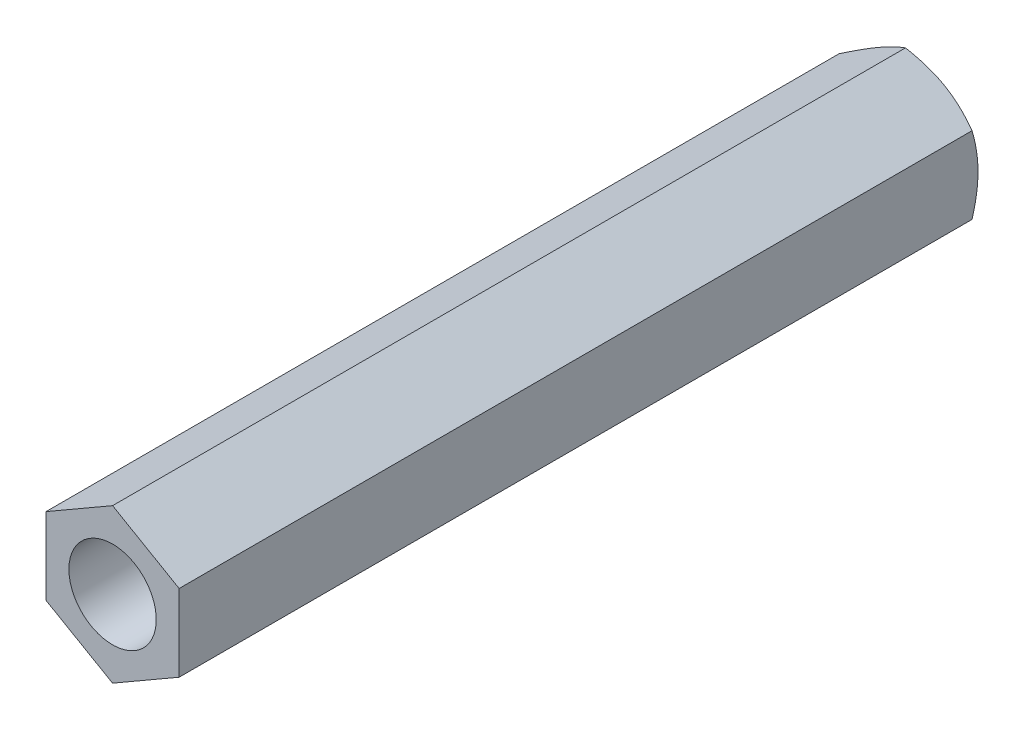
ISO-10303-21;
HEADER;
FILE_DESCRIPTION(('STEP AP214'),'2;1');
FILE_NAME('part.step','',(''),(''),'','','');
FILE_SCHEMA(('AUTOMOTIVE_DESIGN { 1 0 10303 214 1 1 1 1 }'));
ENDSEC;
DATA;
#1=APPLICATION_CONTEXT('core data for automotive mechanical design processes');
#2=APPLICATION_PROTOCOL_DEFINITION('international standard','automotive_design',2000,#1);
#3=PRODUCT_CONTEXT('',#1,'mechanical');
#4=PRODUCT('Part','Part','',(#3));
#5=PRODUCT_RELATED_PRODUCT_CATEGORY('part','',(#4));
#6=PRODUCT_DEFINITION_FORMATION('','',#4);
#7=PRODUCT_DEFINITION_CONTEXT('part definition',#1,'design');
#8=PRODUCT_DEFINITION('design','',#6,#7);
#9=PRODUCT_DEFINITION_SHAPE('','',#8);
#10=(LENGTH_UNIT() NAMED_UNIT(*) SI_UNIT(.MILLI.,.METRE.));
#11=(NAMED_UNIT(*) PLANE_ANGLE_UNIT() SI_UNIT($,.RADIAN.));
#12=(NAMED_UNIT(*) SI_UNIT($,.STERADIAN.) SOLID_ANGLE_UNIT());
#13=UNCERTAINTY_MEASURE_WITH_UNIT(LENGTH_MEASURE(1.E-05),#10,'distance_accuracy_value','');
#14=(GEOMETRIC_REPRESENTATION_CONTEXT(3) GLOBAL_UNCERTAINTY_ASSIGNED_CONTEXT((#13)) GLOBAL_UNIT_ASSIGNED_CONTEXT((#10,
#11,#12)) REPRESENTATION_CONTEXT('',''));
#15=CARTESIAN_POINT('',(0.,0.,0.));
#16=DIRECTION('',(0.,0.,1.));
#17=DIRECTION('',(1.,0.,0.));
#18=AXIS2_PLACEMENT_3D('',#15,#16,#17);
#19=CARTESIAN_POINT('',(3.175,1.83308710467706,19.05));
#20=DIRECTION('',(-0.499999999999999,-0.866025403784439,0.));
#21=DIRECTION('',(0.866025403784439,-0.499999999999999,0.));
#22=AXIS2_PLACEMENT_3D('',#19,#20,#21);
#23=PLANE('',#22);
#24=CARTESIAN_POINT('',(-0.000200000000001707,3.66628967940796,-18.7663537681942));
#25=CARTESIAN_POINT('',(0.139325396739817,3.58573465404144,-18.8128800659768));
#26=CARTESIAN_POINT('',(0.280055167271127,3.50448428314219,-18.8551941350917));
#27=CARTESIAN_POINT('',(0.56395162529974,3.34057658667739,-18.9290539912917));
#28=CARTESIAN_POINT('',(0.707123357483716,3.25791634856063,-18.960573649091));
#29=CARTESIAN_POINT('',(0.991692464990165,3.09362029773873,-19.0096388950167));
#30=CARTESIAN_POINT('',(1.1330460542292,3.01200976494065,-19.0275110330969));
#31=CARTESIAN_POINT('',(1.41641839775671,2.84840466612415,-19.0488471859677));
#32=CARTESIAN_POINT('',(1.55843612196593,2.76641069482226,-19.0523288683681));
#33=CARTESIAN_POINT('',(1.82380736546737,2.61319853595151,-19.0450882992778));
#34=CARTESIAN_POINT('',(1.94720059658621,2.54195742074888,-19.0361438538564));
#35=CARTESIAN_POINT('',(2.19318314733012,2.39993932886093,-19.0077944236316));
#36=CARTESIAN_POINT('',(2.31577161605926,2.32916284344061,-18.9883797532901));
#37=CARTESIAN_POINT('',(2.5622613944255,2.18685190354838,-18.9398442691888));
#38=CARTESIAN_POINT('',(2.68613150457856,2.11533546210696,-18.9105177015272));
#39=CARTESIAN_POINT('',(2.93202416035301,1.97336927110383,-18.8439578063378));
#40=CARTESIAN_POINT('',(3.05404985657409,1.90291770254254,-18.8067401195501));
#41=CARTESIAN_POINT('',(3.1752,1.83297163462323,-18.7663537681942));
#42=B_SPLINE_CURVE_WITH_KNOTS('',3,(#24,#25,#26,#27,#28,#29,#30,#31,#32,#33,#34,#35,#36,#37,#38,
#39,#40,#41),.UNSPECIFIED.,.F.,.F.,(4,2,2,2,2,2,2,2,4),(0.,0.503278731073367,1.00776724301492,
1.49976968502821,1.99116790059651,2.41904879402149,2.84732618162394,3.28510386250597,
3.72202181665388),.UNSPECIFIED.);
#43=CARTESIAN_POINT('',(0.,3.66617420935412,-18.7664204380104));
#44=VERTEX_POINT('',#43);
#45=CARTESIAN_POINT('',(1.5875,2.74963065701559,-19.05));
#46=VERTEX_POINT('',#45);
#47=EDGE_CURVE('E63',#44,#46,#42,.T.);
#48=ORIENTED_EDGE('',*,*,#47,.F.);
#49=DIRECTION('',(0.,0.,-1.));
#50=VECTOR('',#49,1.);
#51=CARTESIAN_POINT('',(0.,3.66617420935412,19.05));
#52=LINE('',#51,#50);
#53=CARTESIAN_POINT('',(0.,3.66617420935412,19.05));
#54=VERTEX_POINT('',#53);
#55=EDGE_CURVE('E184',#54,#44,#52,.T.);
#56=ORIENTED_EDGE('',*,*,#55,.F.);
#57=DIRECTION('',(-0.866025403784439,0.499999999999999,0.));
#58=VECTOR('',#57,1.);
#59=CARTESIAN_POINT('',(3.175,1.83308710467706,19.05));
#60=LINE('',#59,#58);
#61=CARTESIAN_POINT('',(3.175,1.83308710467706,19.05));
#62=VERTEX_POINT('',#61);
#63=EDGE_CURVE('E300',#62,#54,#60,.T.);
#64=ORIENTED_EDGE('',*,*,#63,.F.);
#65=DIRECTION('',(0.,0.,-1.));
#66=VECTOR('',#65,1.);
#67=CARTESIAN_POINT('',(3.175,1.83308710467706,19.05));
#68=LINE('',#67,#66);
#69=CARTESIAN_POINT('',(3.175,1.83308710467706,-18.7664204380104));
#70=VERTEX_POINT('',#69);
#71=EDGE_CURVE('E165',#62,#70,#68,.T.);
#72=ORIENTED_EDGE('',*,*,#71,.T.);
#73=EDGE_CURVE('E158',#46,#70,#42,.T.);
#74=ORIENTED_EDGE('',*,*,#73,.F.);
#75=EDGE_LOOP('',(#48,#56,#64,#72,#74));
#76=FACE_BOUND('',#75,.T.);
#77=ADVANCED_FACE('F43',(#76),#23,.F.);
#78=CARTESIAN_POINT('',(0.,3.66617420935412,19.05));
#79=DIRECTION('',(0.5,-0.866025403784438,0.));
#80=DIRECTION('',(0.866025403784438,0.5,0.));
#81=AXIS2_PLACEMENT_3D('',#78,#79,#80);
#82=PLANE('',#81);
#83=CARTESIAN_POINT('',(-3.1752,1.83297163462322,-18.7663537681942));
#84=CARTESIAN_POINT('',(-3.03567460326018,1.91352665998975,-18.8128800659768));
#85=CARTESIAN_POINT('',(-2.89494483272887,1.99477703088899,-18.8551941350917));
#86=CARTESIAN_POINT('',(-2.61104837470026,2.15868472735379,-18.9290539912917));
#87=CARTESIAN_POINT('',(-2.46787664251628,2.24134496547056,-18.960573649091));
#88=CARTESIAN_POINT('',(-2.18330753500983,2.40564101629246,-19.0096388950167));
#89=CARTESIAN_POINT('',(-2.0419539457708,2.48725154909053,-19.0275110330969));
#90=CARTESIAN_POINT('',(-1.75858160224329,2.65085664790703,-19.0488471859677));
#91=CARTESIAN_POINT('',(-1.61656387803407,2.73285061920893,-19.0523288683681));
#92=CARTESIAN_POINT('',(-1.35119263453263,2.88606277807967,-19.0450882992778));
#93=CARTESIAN_POINT('',(-1.22779940341379,2.95730389328231,-19.0361438538564));
#94=CARTESIAN_POINT('',(-0.981816852669883,3.09932198517026,-19.0077944236316));
#95=CARTESIAN_POINT('',(-0.859228383940737,3.17009847059057,-18.9883797532901));
#96=CARTESIAN_POINT('',(-0.612738605574497,3.31240941048281,-18.9398442691888));
#97=CARTESIAN_POINT('',(-0.488868495421442,3.38392585192423,-18.9105177015272));
#98=CARTESIAN_POINT('',(-0.242975839646995,3.52589204292736,-18.8439578063378));
#99=CARTESIAN_POINT('',(-0.120950143425914,3.59634361148865,-18.8067401195501));
#100=CARTESIAN_POINT('',(0.000199999999998535,3.66628967940796,-18.7663537681942));
#101=B_SPLINE_CURVE_WITH_KNOTS('',3,(#83,#84,#85,#86,#87,#88,#89,#90,#91,#92,#93,#94,#95,#96,
#97,#98,#99,#100),.UNSPECIFIED.,.F.,.F.,(4,2,2,2,2,2,2,2,4),(0.,0.503278731073367,
1.00776724301492,1.49976968502821,1.99116790059651,2.41904879402149,2.84732618162394,
3.28510386250597,3.72202181665389),.UNSPECIFIED.);
#102=CARTESIAN_POINT('',(-3.175,1.83308710467706,-18.7664204380104));
#103=VERTEX_POINT('',#102);
#104=CARTESIAN_POINT('',(-1.5875,2.74963065701559,-19.05));
#105=VERTEX_POINT('',#104);
#106=EDGE_CURVE('E73',#103,#105,#101,.T.);
#107=ORIENTED_EDGE('',*,*,#106,.F.);
#108=DIRECTION('',(0.,0.,-1.));
#109=VECTOR('',#108,1.);
#110=CARTESIAN_POINT('',(-3.175,1.83308710467706,19.05));
#111=LINE('',#110,#109);
#112=CARTESIAN_POINT('',(-3.175,1.83308710467706,19.05));
#113=VERTEX_POINT('',#112);
#114=EDGE_CURVE('E181',#113,#103,#111,.T.);
#115=ORIENTED_EDGE('',*,*,#114,.F.);
#116=DIRECTION('',(-0.866025403784438,-0.5,0.));
#117=VECTOR('',#116,1.);
#118=CARTESIAN_POINT('',(0.,3.66617420935412,19.05));
#119=LINE('',#118,#117);
#120=EDGE_CURVE('E298',#54,#113,#119,.T.);
#121=ORIENTED_EDGE('',*,*,#120,.F.);
#122=ORIENTED_EDGE('',*,*,#55,.T.);
#123=EDGE_CURVE('E213',#105,#44,#101,.T.);
#124=ORIENTED_EDGE('',*,*,#123,.F.);
#125=EDGE_LOOP('',(#107,#115,#121,#122,#124));
#126=FACE_BOUND('',#125,.T.);
#127=ADVANCED_FACE('F220',(#126),#82,.F.);
#128=CARTESIAN_POINT('',(-3.175,1.83308710467706,19.05));
#129=DIRECTION('',(1.,0.,0.));
#130=DIRECTION('',(0.,0.,-1.));
#131=AXIS2_PLACEMENT_3D('',#128,#129,#130);
#132=PLANE('',#131);
#133=CARTESIAN_POINT('',(-3.175,-18.3077198245256,-10.1553468926019));
#134=CARTESIAN_POINT('',(-3.175,-17.7414336118744,-10.4774591611531));
#135=CARTESIAN_POINT('',(-3.175,-17.1749794962075,-10.7992773985625));
#136=CARTESIAN_POINT('',(-3.175,-16.0409710717409,-11.4423663332615));
#137=CARTESIAN_POINT('',(-3.175,-15.4734162326695,-11.7636360952922));
#138=CARTESIAN_POINT('',(-3.175,-14.3258073391395,-12.4116671623965));
#139=CARTESIAN_POINT('',(-3.175,-13.7457391640371,-12.7384034734853));
#140=CARTESIAN_POINT('',(-3.175,-12.5852209444679,-13.3897619072163));
#141=CARTESIAN_POINT('',(-3.175,-12.0047719497107,-13.714385897732));
#142=CARTESIAN_POINT('',(-3.175,-11.0191420258565,-14.2626524526183));
#143=CARTESIAN_POINT('',(-3.175,-10.6143432188106,-14.4869816120892));
#144=CARTESIAN_POINT('',(-3.175,-9.80376519343896,-14.9338608056584));
#145=CARTESIAN_POINT('',(-3.175,-9.39798597859403,-15.1564108460611));
#146=CARTESIAN_POINT('',(-3.175,-8.58352092055346,-15.599811955528));
#147=CARTESIAN_POINT('',(-3.175,-8.17482988492007,-15.8206534962061));
#148=CARTESIAN_POINT('',(-3.175,-7.35556605328097,-16.258489895697));
#149=CARTESIAN_POINT('',(-3.175,-6.94499396509323,-16.4754860723258));
#150=CARTESIAN_POINT('',(-3.175,-6.33011777093839,-16.7947587542909));
#151=CARTESIAN_POINT('',(-3.175,-6.12699490835783,-16.8993081827817));
#152=CARTESIAN_POINT('',(-3.175,-5.71979092918565,-17.1065216467259));
#153=CARTESIAN_POINT('',(-3.175,-5.51570982445749,-17.209185705444));
#154=CARTESIAN_POINT('',(-3.175,-5.10603014130114,-17.4122034627545));
#155=CARTESIAN_POINT('',(-3.175,-4.90042979267829,-17.5125535984638));
#156=CARTESIAN_POINT('',(-3.175,-4.48765919259732,-17.7099540852167));
#157=CARTESIAN_POINT('',(-3.175,-4.28048903370909,-17.8070046290098));
#158=CARTESIAN_POINT('',(-3.175,-3.86553720313379,-17.9959421818625));
#159=CARTESIAN_POINT('',(-3.175,-3.65776983492072,-18.0878604405887));
#160=CARTESIAN_POINT('',(-3.175,-3.23950994033964,-18.2655212585588));
#161=CARTESIAN_POINT('',(-3.175,-3.02901662105306,-18.3512619710252));
#162=CARTESIAN_POINT('',(-3.175,-2.60514167741069,-18.5136797470457));
#163=CARTESIAN_POINT('',(-3.175,-2.39176872264198,-18.5903792251754));
#164=CARTESIAN_POINT('',(-3.175,-1.96089322475478,-18.731016552524));
#165=CARTESIAN_POINT('',(-3.175,-1.74339415581994,-18.7949646579037));
#166=CARTESIAN_POINT('',(-3.175,-1.48450390682431,-18.8596299108689));
#167=CARTESIAN_POINT('',(-3.175,-1.44527604575854,-18.8691226532026));
#168=CARTESIAN_POINT('',(-3.175,-1.36667302860545,-18.8874980649563));
#169=CARTESIAN_POINT('',(-3.175,-1.32729785715162,-18.8963806687472));
#170=CARTESIAN_POINT('',(-3.175,-1.20894095435893,-18.9220654189802));
#171=CARTESIAN_POINT('',(-3.175,-1.12974616630958,-18.9378998936088));
#172=CARTESIAN_POINT('',(-3.175,-0.970876430049809,-18.9667066164054));
#173=CARTESIAN_POINT('',(-3.175,-0.891201738690738,-18.97968027631));
#174=CARTESIAN_POINT('',(-3.175,-0.731408656361065,-19.0025205146401));
#175=CARTESIAN_POINT('',(-3.175,-0.65129028408484,-19.0123872229778));
#176=CARTESIAN_POINT('',(-3.175,-0.492507512919429,-19.0286127160931));
#177=CARTESIAN_POINT('',(-3.175,-0.413850711881396,-19.0350450797399));
#178=CARTESIAN_POINT('',(-3.175,-0.256342714002498,-19.0445923976316));
#179=CARTESIAN_POINT('',(-3.175,-0.177491521843976,-19.0477074310143));
#180=CARTESIAN_POINT('',(-3.175,0.0592412691015746,-19.0519350175385));
#181=CARTESIAN_POINT('',(-3.175,0.217251860980885,-19.0479248037829));
#182=CARTESIAN_POINT('',(-3.175,0.481847136035634,-19.0300339093949));
#183=CARTESIAN_POINT('',(-3.175,0.588697929183111,-19.0197248990427));
#184=CARTESIAN_POINT('',(-3.175,0.801703959788124,-18.9934186498442));
#185=CARTESIAN_POINT('',(-3.175,0.907859117778311,-18.9774207722692));
#186=CARTESIAN_POINT('',(-3.175,1.22501510253335,-18.9217345418408));
#187=CARTESIAN_POINT('',(-3.175,1.43468437185832,-18.8743552971295));
#188=CARTESIAN_POINT('',(-3.175,1.74885194367921,-18.7910296812125));
#189=CARTESIAN_POINT('',(-3.175,1.8549373084425,-18.7607187692784));
#190=CARTESIAN_POINT('',(-3.175,2.06607886933288,-18.6966710845962));
#191=CARTESIAN_POINT('',(-3.175,2.17113505546933,-18.6629342786275));
#192=CARTESIAN_POINT('',(-3.175,2.38026617545869,-18.5925949965778));
#193=CARTESIAN_POINT('',(-3.175,2.48434118051095,-18.5559927302502));
#194=CARTESIAN_POINT('',(-3.175,2.69160594572534,-18.4803848432953));
#195=CARTESIAN_POINT('',(-3.175,2.794795746035,-18.4413793323281));
#196=CARTESIAN_POINT('',(-3.175,3.13671562539364,-18.3083219008354));
#197=CARTESIAN_POINT('',(-3.175,3.37372995793029,-18.2098629997906));
#198=CARTESIAN_POINT('',(-3.175,3.8446390043056,-18.0057151300189));
#199=CARTESIAN_POINT('',(-3.175,4.07853296301211,-17.9000244478076));
#200=CARTESIAN_POINT('',(-3.175,4.54415587744704,-17.6835596122308));
#201=CARTESIAN_POINT('',(-3.175,4.77588311896816,-17.57278178634));
#202=CARTESIAN_POINT('',(-3.175,5.23756839741154,-17.3476708573541));
#203=CARTESIAN_POINT('',(-3.175,5.46752659974872,-17.2333380918324));
#204=CARTESIAN_POINT('',(-3.175,5.92668133297101,-17.0017787685871));
#205=CARTESIAN_POINT('',(-3.175,6.15587464235502,-16.8845458382158));
#206=CARTESIAN_POINT('',(-3.175,6.61324264214388,-16.6481022689275));
#207=CARTESIAN_POINT('',(-3.175,6.84141731144986,-16.528891589285));
#208=CARTESIAN_POINT('',(-3.175,7.52456448119139,-16.1691161715611));
#209=CARTESIAN_POINT('',(-3.175,7.9783549012064,-15.9263087336464));
#210=CARTESIAN_POINT('',(-3.175,8.81631592080397,-15.4735290959902));
#211=CARTESIAN_POINT('',(-3.175,9.20076397526635,-15.2640678393263));
#212=CARTESIAN_POINT('',(-3.175,9.9686618552056,-14.84321295972));
#213=CARTESIAN_POINT('',(-3.175,10.352111553102,-14.6318191040184));
#214=CARTESIAN_POINT('',(-3.175,11.1165251951853,-14.2086073671623));
#215=CARTESIAN_POINT('',(-3.175,11.4974925647695,-13.9967956643198));
#216=CARTESIAN_POINT('',(-3.175,12.2587925253838,-13.5721536847341));
#217=CARTESIAN_POINT('',(-3.175,12.6391251945714,-13.3593235481576));
#218=CARTESIAN_POINT('',(-3.175,13.01925251055,-13.1461290260034));
#219=B_SPLINE_CURVE_WITH_KNOTS('',3,(#133,#134,#135,#136,#137,#138,#139,#140,#141,#142,#143,
#144,#145,#146,#147,#148,#149,#150,#151,#152,#153,#154,#155,#156,#157,#158,#159,#160,#161,#162,
#163,#164,#165,#166,#167,#168,#169,#170,#171,#172,#173,#174,#175,#176,#177,#178,#179,#180,#181,
#182,#183,#184,#185,#186,#187,#188,#189,#190,#191,#192,#193,#194,#195,#196,#197,#198,#199,#200,
#201,#202,#203,#204,#205,#206,#207,#208,#209,#210,#211,#212,#213,#214,#215,#216,#217,#218),
.UNSPECIFIED.,.F.,.F.,(4,2,2,2,2,2,2,2,2,2,2,2,2,2,2,2,2,2,2,2,2,2,2,2,2,2,2,2,2,2,2,2,2,2,2,2,
2,2,2,2,2,2,4),(0.,1.95446426855776,3.91098956048036,5.90826616112014,7.90343413412598,
9.29183707773721,10.6802350993394,12.0738509984841,13.4669796867842,14.1523230153035,
14.8376578812268,15.5239856968566,16.2102733507044,16.89178214748,17.5734938431557,
18.2534782517595,18.9329135106573,19.0539901992569,19.1750798910614,19.4173159564094,
19.6594322157952,19.9015383501391,20.138225089356,20.3749061820872,20.8484193597508,
21.1703140964425,21.4922449859031,22.1361728610031,22.4671323021629,22.7980949529006,
23.1290333995789,23.4599567566847,24.2296988766852,24.9996240137207,25.7701139944362,
26.5405310323478,27.3128254100649,28.0851357106074,29.6291005090517,30.9425144939026,
32.2560888047696,33.5637579777836,34.8712520757708),.UNSPECIFIED.);
#220=CARTESIAN_POINT('',(-3.175,-1.83308710467706,-18.7664204380104));
#221=VERTEX_POINT('',#220);
#222=CARTESIAN_POINT('',(-3.175,0.,-19.05));
#223=VERTEX_POINT('',#222);
#224=EDGE_CURVE('E311',#221,#223,#219,.T.);
#225=ORIENTED_EDGE('',*,*,#224,.F.);
#226=DIRECTION('',(0.,0.,-1.));
#227=VECTOR('',#226,1.);
#228=CARTESIAN_POINT('',(-3.175,-1.83308710467706,19.05));
#229=LINE('',#228,#227);
#230=CARTESIAN_POINT('',(-3.175,-1.83308710467706,19.05));
#231=VERTEX_POINT('',#230);
#232=EDGE_CURVE('E171',#231,#221,#229,.T.);
#233=ORIENTED_EDGE('',*,*,#232,.F.);
#234=DIRECTION('',(0.,-1.,0.));
#235=VECTOR('',#234,1.);
#236=CARTESIAN_POINT('',(-3.175,1.83308710467706,19.05));
#237=LINE('',#236,#235);
#238=EDGE_CURVE('E293',#113,#231,#237,.T.);
#239=ORIENTED_EDGE('',*,*,#238,.F.);
#240=ORIENTED_EDGE('',*,*,#114,.T.);
#241=EDGE_CURVE('E242',#223,#103,#219,.T.);
#242=ORIENTED_EDGE('',*,*,#241,.F.);
#243=EDGE_LOOP('',(#225,#233,#239,#240,#242));
#244=FACE_BOUND('',#243,.T.);
#245=ADVANCED_FACE('F319',(#244),#132,.F.);
#246=CARTESIAN_POINT('',(-3.175,-1.83308710467706,19.05));
#247=DIRECTION('',(0.499999999999999,0.866025403784439,0.));
#248=DIRECTION('',(-0.866025403784439,0.499999999999999,0.));
#249=AXIS2_PLACEMENT_3D('',#246,#247,#248);
#250=PLANE('',#249);
#251=CARTESIAN_POINT('',(0.000200000000002277,-3.66628967940796,-18.7663537681942));
#252=CARTESIAN_POINT('',(-0.139325396739816,-3.58573465404143,-18.8128800659768));
#253=CARTESIAN_POINT('',(-0.280055167271126,-3.50448428314219,-18.8551941350917));
#254=CARTESIAN_POINT('',(-0.56395162529974,-3.34057658667739,-18.9290539912917));
#255=CARTESIAN_POINT('',(-0.707123357483716,-3.25791634856063,-18.960573649091));
#256=CARTESIAN_POINT('',(-0.991692464990164,-3.09362029773873,-19.0096388950167));
#257=CARTESIAN_POINT('',(-1.13304605422919,-3.01200976494065,-19.0275110330969));
#258=CARTESIAN_POINT('',(-1.4164183977567,-2.84840466612415,-19.0488471859677));
#259=CARTESIAN_POINT('',(-1.55843612196592,-2.76641069482226,-19.0523288683681));
#260=CARTESIAN_POINT('',(-1.82380736546737,-2.61319853595151,-19.0450882992778));
#261=CARTESIAN_POINT('',(-1.94720059658621,-2.54195742074887,-19.0361438538564));
#262=CARTESIAN_POINT('',(-2.19318314733012,-2.39993932886093,-19.0077944236316));
#263=CARTESIAN_POINT('',(-2.31577161605926,-2.32916284344061,-18.9883797532901));
#264=CARTESIAN_POINT('',(-2.5622613944255,-2.18685190354837,-18.9398442691888));
#265=CARTESIAN_POINT('',(-2.68613150457856,-2.11533546210696,-18.9105177015272));
#266=CARTESIAN_POINT('',(-2.93202416035301,-1.97336927110383,-18.8439578063378));
#267=CARTESIAN_POINT('',(-3.05404985657409,-1.90291770254253,-18.8067401195501));
#268=CARTESIAN_POINT('',(-3.1752,-1.83297163462322,-18.7663537681942));
#269=B_SPLINE_CURVE_WITH_KNOTS('',3,(#251,#252,#253,#254,#255,#256,#257,#258,#259,#260,#261,
#262,#263,#264,#265,#266,#267,#268),.UNSPECIFIED.,.F.,.F.,(4,2,2,2,2,2,2,2,4),(0.,
0.503278731073367,1.00776724301492,1.49976968502821,1.9911679005965,2.41904879402148,
2.84732618162394,3.28510386250597,3.72202181665389),.UNSPECIFIED.);
#270=CARTESIAN_POINT('',(0.,-3.66617420935412,-18.7664204380104));
#271=VERTEX_POINT('',#270);
#272=CARTESIAN_POINT('',(-1.5875,-2.74963065701559,-19.05));
#273=VERTEX_POINT('',#272);
#274=EDGE_CURVE('E223',#271,#273,#269,.T.);
#275=ORIENTED_EDGE('',*,*,#274,.F.);
#276=DIRECTION('',(0.,0.,-1.));
#277=VECTOR('',#276,1.);
#278=CARTESIAN_POINT('',(0.,-3.66617420935412,19.05));
#279=LINE('',#278,#277);
#280=CARTESIAN_POINT('',(0.,-3.66617420935412,19.05));
#281=VERTEX_POINT('',#280);
#282=EDGE_CURVE('E164',#281,#271,#279,.T.);
#283=ORIENTED_EDGE('',*,*,#282,.F.);
#284=DIRECTION('',(0.866025403784439,-0.499999999999999,0.));
#285=VECTOR('',#284,1.);
#286=CARTESIAN_POINT('',(-3.175,-1.83308710467706,19.05));
#287=LINE('',#286,#285);
#288=EDGE_CURVE('E289',#231,#281,#287,.T.);
#289=ORIENTED_EDGE('',*,*,#288,.F.);
#290=ORIENTED_EDGE('',*,*,#232,.T.);
#291=EDGE_CURVE('E227',#273,#221,#269,.T.);
#292=ORIENTED_EDGE('',*,*,#291,.F.);
#293=EDGE_LOOP('',(#275,#283,#289,#290,#292));
#294=FACE_BOUND('',#293,.T.);
#295=ADVANCED_FACE('F285',(#294),#250,.F.);
#296=CARTESIAN_POINT('',(0.,-3.66617420935412,19.05));
#297=DIRECTION('',(-0.5,0.866025403784438,0.));
#298=DIRECTION('',(-0.866025403784438,-0.5,0.));
#299=AXIS2_PLACEMENT_3D('',#296,#297,#298);
#300=PLANE('',#299);
#301=CARTESIAN_POINT('',(3.1752,-1.83297163462322,-18.7663537681942));
#302=CARTESIAN_POINT('',(3.03567460326018,-1.91352665998974,-18.8128800659768));
#303=CARTESIAN_POINT('',(2.89494483272887,-1.99477703088899,-18.8551941350917));
#304=CARTESIAN_POINT('',(2.61104837470026,-2.15868472735379,-18.9290539912917));
#305=CARTESIAN_POINT('',(2.46787664251628,-2.24134496547055,-18.960573649091));
#306=CARTESIAN_POINT('',(2.18330753500983,-2.40564101629245,-19.0096388950167));
#307=CARTESIAN_POINT('',(2.0419539457708,-2.48725154909053,-19.0275110330969));
#308=CARTESIAN_POINT('',(1.75858160224329,-2.65085664790703,-19.0488471859677));
#309=CARTESIAN_POINT('',(1.61656387803407,-2.73285061920892,-19.0523288683681));
#310=CARTESIAN_POINT('',(1.35119263453263,-2.88606277807967,-19.0450882992778));
#311=CARTESIAN_POINT('',(1.22779940341379,-2.95730389328231,-19.0361438538564));
#312=CARTESIAN_POINT('',(0.981816852669883,-3.09932198517025,-19.0077944236316));
#313=CARTESIAN_POINT('',(0.859228383940738,-3.17009847059057,-18.9883797532901));
#314=CARTESIAN_POINT('',(0.612738605574498,-3.31240941048281,-18.9398442691888));
#315=CARTESIAN_POINT('',(0.488868495421443,-3.38392585192422,-18.9105177015272));
#316=CARTESIAN_POINT('',(0.242975839646997,-3.52589204292735,-18.8439578063378));
#317=CARTESIAN_POINT('',(0.120950143425915,-3.59634361148865,-18.8067401195501));
#318=CARTESIAN_POINT('',(-0.000199999999997255,-3.66628967940796,-18.7663537681942));
#319=B_SPLINE_CURVE_WITH_KNOTS('',3,(#301,#302,#303,#304,#305,#306,#307,#308,#309,#310,#311,
#312,#313,#314,#315,#316,#317,#318),.UNSPECIFIED.,.F.,.F.,(4,2,2,2,2,2,2,2,4),(0.,
0.503278731073367,1.00776724301492,1.49976968502821,1.9911679005965,2.41904879402148,
2.84732618162393,3.28510386250597,3.72202181665388),.UNSPECIFIED.);
#320=CARTESIAN_POINT('',(3.175,-1.83308710467711,-18.7664204380104));
#321=VERTEX_POINT('',#320);
#322=CARTESIAN_POINT('',(1.5875,-2.74963065701559,-19.05));
#323=VERTEX_POINT('',#322);
#324=EDGE_CURVE('E138',#321,#323,#319,.T.);
#325=ORIENTED_EDGE('',*,*,#324,.F.);
#326=DIRECTION('',(0.,0.,-1.));
#327=VECTOR('',#326,1.);
#328=CARTESIAN_POINT('',(3.175,-1.83308710467706,19.05));
#329=LINE('',#328,#327);
#330=CARTESIAN_POINT('',(3.175,-1.83308710467706,19.05));
#331=VERTEX_POINT('',#330);
#332=EDGE_CURVE('E153',#331,#321,#329,.T.);
#333=ORIENTED_EDGE('',*,*,#332,.F.);
#334=DIRECTION('',(0.866025403784438,0.5,0.));
#335=VECTOR('',#334,1.);
#336=CARTESIAN_POINT('',(0.,-3.66617420935412,19.05));
#337=LINE('',#336,#335);
#338=EDGE_CURVE('E287',#281,#331,#337,.T.);
#339=ORIENTED_EDGE('',*,*,#338,.F.);
#340=ORIENTED_EDGE('',*,*,#282,.T.);
#341=EDGE_CURVE('E156',#323,#271,#319,.T.);
#342=ORIENTED_EDGE('',*,*,#341,.F.);
#343=EDGE_LOOP('',(#325,#333,#339,#340,#342));
#344=FACE_BOUND('',#343,.T.);
#345=ADVANCED_FACE('F151',(#344),#300,.F.);
#346=CARTESIAN_POINT('',(3.175,-1.83308710467706,19.05));
#347=DIRECTION('',(-1.,0.,0.));
#348=DIRECTION('',(0.,-1.,0.));
#349=AXIS2_PLACEMENT_3D('',#346,#347,#348);
#350=PLANE('',#349);
#351=CARTESIAN_POINT('',(3.175,-18.3077198939669,-10.1553468530995));
#352=CARTESIAN_POINT('',(3.175,-17.7414336794976,-10.4774591227208));
#353=CARTESIAN_POINT('',(3.175,-17.1749795620134,-10.7992773612016));
#354=CARTESIAN_POINT('',(3.175,-16.0409711339116,-11.4423662980493));
#355=CARTESIAN_POINT('',(3.175,-15.4734162930224,-11.7636360611574));
#356=CARTESIAN_POINT('',(3.175,-14.3258073958419,-12.4116671304335));
#357=CARTESIAN_POINT('',(3.175,-13.7457392189069,-12.738403442617));
#358=CARTESIAN_POINT('',(3.175,-12.5852209956805,-13.3897618785448));
#359=CARTESIAN_POINT('',(3.175,-12.0047719990987,-13.7143858701626));
#360=CARTESIAN_POINT('',(3.175,-11.0191420715459,-14.2626524272701));
#361=CARTESIAN_POINT('',(3.175,-10.6143432626229,-14.4869815878543));
#362=CARTESIAN_POINT('',(3.175,-9.80376523349893,-14.9338607836541));
#363=CARTESIAN_POINT('',(3.175,-9.39798601677873,-15.1564108251741));
#364=CARTESIAN_POINT('',(3.175,-8.58352095497882,-15.599811936886));
#365=CARTESIAN_POINT('',(3.175,-8.17482991746137,-15.820653478692));
#366=CARTESIAN_POINT('',(3.175,-7.35556608205735,-16.2584898804426));
#367=CARTESIAN_POINT('',(3.175,-6.94499399198875,-16.4754860582032));
#368=CARTESIAN_POINT('',(3.175,-6.33011779502902,-16.7947587418583));
#369=CARTESIAN_POINT('',(3.175,-6.12699493152466,-16.8993081709062));
#370=CARTESIAN_POINT('',(3.175,-5.71979095050412,-17.1065216359646));
#371=CARTESIAN_POINT('',(3.175,-5.51570984485139,-17.2091856952399));
#372=CARTESIAN_POINT('',(3.175,-5.10603015984098,-17.4122034536651));
#373=CARTESIAN_POINT('',(3.175,-4.90042981028861,-17.5125535899319));
#374=CARTESIAN_POINT('',(3.175,-4.48765920834508,-17.7099540777957));
#375=CARTESIAN_POINT('',(3.175,-4.28048904852381,-17.8070046221423));
#376=CARTESIAN_POINT('',(3.175,-3.86553721608683,-17.9959421760861));
#377=CARTESIAN_POINT('',(3.175,-3.65776984694522,-18.0878604353502));
#378=CARTESIAN_POINT('',(3.175,-3.23950995049373,-18.2655212543769));
#379=CARTESIAN_POINT('',(3.175,-3.02901663026529,-18.3512619673619));
#380=CARTESIAN_POINT('',(3.175,-2.60514168472334,-18.513679744377));
#381=CARTESIAN_POINT('',(3.175,-2.39176872899704,-18.5903792229826));
#382=CARTESIAN_POINT('',(3.175,-1.96089322916193,-18.7310165512036));
#383=CARTESIAN_POINT('',(3.175,-1.74339415923684,-18.7949646569799));
#384=CARTESIAN_POINT('',(3.175,-1.48450390900375,-18.859629910337));
#385=CARTESIAN_POINT('',(3.175,-1.44527604771116,-18.8691226527367));
#386=CARTESIAN_POINT('',(3.175,-1.36667303010265,-18.8874980646158));
#387=CARTESIAN_POINT('',(3.175,-1.32729785842023,-18.896380668466));
#388=CARTESIAN_POINT('',(3.175,-1.20894095493914,-18.9220654188662));
#389=CARTESIAN_POINT('',(3.175,-1.12974616642743,-18.9378998935918));
#390=CARTESIAN_POINT('',(3.175,-0.970876429238656,-18.9667066165481));
#391=CARTESIAN_POINT('',(3.175,-0.891201737412969,-18.9796802765157));
#392=CARTESIAN_POINT('',(3.175,-0.731408654145445,-19.0025205149337));
#393=CARTESIAN_POINT('',(3.175,-0.651290281397986,-19.0123872232963));
#394=CARTESIAN_POINT('',(3.175,-0.492507509308778,-19.0286127164191));
#395=CARTESIAN_POINT('',(3.175,-0.413850707818281,-19.0350450800497));
#396=CARTESIAN_POINT('',(3.175,-0.256342709034836,-19.0445923978691));
#397=CARTESIAN_POINT('',(3.175,-0.177491516424232,-19.0477074311957));
#398=CARTESIAN_POINT('',(3.175,0.0592412758752482,-19.0519350174914));
#399=CARTESIAN_POINT('',(3.175,0.217251868652552,-19.0479248035034));
#400=CARTESIAN_POINT('',(3.175,0.481847144806088,-19.0300339086383));
#401=CARTESIAN_POINT('',(3.175,0.588697938164518,-19.0197248980995));
#402=CARTESIAN_POINT('',(3.175,0.801703969181494,-18.9934186485182));
#403=CARTESIAN_POINT('',(3.175,0.907859127372689,-18.9774207707472));
#404=CARTESIAN_POINT('',(3.175,1.22501511271807,-18.9217345397273));
#405=CARTESIAN_POINT('',(3.175,1.43468438241961,-18.8743552946174));
#406=CARTESIAN_POINT('',(3.175,1.74885195480961,-18.7910296781116));
#407=CARTESIAN_POINT('',(3.175,1.85493731977094,-18.7607187659784));
#408=CARTESIAN_POINT('',(3.175,2.06607888105491,-18.6966710809042));
#409=CARTESIAN_POINT('',(3.175,2.17113506738691,-18.6629342747428));
#410=CARTESIAN_POINT('',(3.175,2.38026618776587,-18.5925949923147));
#411=CARTESIAN_POINT('',(3.175,2.4843411930122,-18.5559927258015));
#412=CARTESIAN_POINT('',(3.175,2.69160595861467,-18.4803848384821));
#413=CARTESIAN_POINT('',(3.175,2.79479575911833,-18.4413793273362));
#414=CARTESIAN_POINT('',(3.175,3.13671563968067,-18.3083218950425));
#415=CARTESIAN_POINT('',(3.175,3.37372997321841,-18.2098629933644));
#416=CARTESIAN_POINT('',(3.175,3.84463902158936,-18.0057151223256));
#417=CARTESIAN_POINT('',(3.175,4.07853298129044,-17.9000244394803));
#418=CARTESIAN_POINT('',(3.175,4.54415589771232,-17.6835596026395));
#419=CARTESIAN_POINT('',(3.175,4.77588314022582,-17.5727817761187));
#420=CARTESIAN_POINT('',(3.175,5.23756842065429,-17.347670845878));
#421=CARTESIAN_POINT('',(3.175,5.46752662398418,-17.2333380797315));
#422=CARTESIAN_POINT('',(3.175,5.92668135919113,-17.0017787552423));
#423=CARTESIAN_POINT('',(3.175,6.15587466956713,-16.8845458242519));
#424=CARTESIAN_POINT('',(3.175,6.61324267134146,-16.6481022537301));
#425=CARTESIAN_POINT('',(3.175,6.84141734164093,-16.5288915734731));
#426=CARTESIAN_POINT('',(3.175,7.5245645143656,-16.1691161539117));
#427=CARTESIAN_POINT('',(3.175,7.9783549363725,-15.9263087147798));
#428=CARTESIAN_POINT('',(3.175,8.81631595947147,-15.4735290749839));
#429=CARTESIAN_POINT('',(3.175,9.20076401544337,-15.2640678173973));
#430=CARTESIAN_POINT('',(3.175,9.96866189840537,-14.8432129359533));
#431=CARTESIAN_POINT('',(3.175,10.352111597815,-14.6318190793368));
#432=CARTESIAN_POINT('',(3.175,11.1165252429368,-14.2086073406518));
#433=CARTESIAN_POINT('',(3.175,11.4974926140463,-13.9967956368953));
#434=CARTESIAN_POINT('',(3.175,12.2587925777135,-13.5721536554858));
#435=CARTESIAN_POINT('',(3.175,12.6391252484287,-13.3593235179994));
#436=CARTESIAN_POINT('',(3.175,13.0192525659358,-13.1461289949369));
#437=B_SPLINE_CURVE_WITH_KNOTS('',3,(#351,#352,#353,#354,#355,#356,#357,#358,#359,#360,#361,
#362,#363,#364,#365,#366,#367,#368,#369,#370,#371,#372,#373,#374,#375,#376,#377,#378,#379,#380,
#381,#382,#383,#384,#385,#386,#387,#388,#389,#390,#391,#392,#393,#394,#395,#396,#397,#398,#399,
#400,#401,#402,#403,#404,#405,#406,#407,#408,#409,#410,#411,#412,#413,#414,#415,#416,#417,#418,
#419,#420,#421,#422,#423,#424,#425,#426,#427,#428,#429,#430,#431,#432,#433,#434,#435,#436),
.UNSPECIFIED.,.F.,.F.,(4,2,2,2,2,2,2,2,2,2,2,2,2,2,2,2,2,2,2,2,2,2,2,2,2,2,2,2,2,2,2,2,2,2,2,2,
2,2,2,2,2,2,4),(0.,1.95446427488583,3.91098957314653,5.9082661801881,7.90343415958539,
9.29183710974105,10.6802351378877,12.0738510436137,13.4669797384892,14.1523230702376,
14.8376579393898,15.5239857582594,16.2102734153463,16.8917822153222,17.5734939142012,
18.2534783259903,18.9329135880668,19.0539902773742,19.1750799698869,19.4173160366512,
19.6594322974479,19.9015384332029,20.1382251737674,20.374906267846,20.8484194482092,
21.1703141855846,21.4922450757289,22.1361729521966,22.4671323940921,22.7980950455655,
23.129033492978,23.459956850818,24.2296989743211,24.9996241148593,25.7701140990761,
26.5405311404892,27.3128255217016,28.0851358257394,29.6291006311756,30.9425146213276,
32.2560889374954,33.5637581158411,34.8712522191605),.UNSPECIFIED.);
#438=CARTESIAN_POINT('',(3.175,0.,-19.05));
#439=VERTEX_POINT('',#438);
#440=EDGE_CURVE('E145',#70,#439,#437,.F.);
#441=ORIENTED_EDGE('',*,*,#440,.F.);
#442=ORIENTED_EDGE('',*,*,#71,.F.);
#443=DIRECTION('',(0.,1.,0.));
#444=VECTOR('',#443,1.);
#445=CARTESIAN_POINT('',(3.175,-1.83308710467706,19.05));
#446=LINE('',#445,#444);
#447=EDGE_CURVE('E162',#331,#62,#446,.T.);
#448=ORIENTED_EDGE('',*,*,#447,.F.);
#449=ORIENTED_EDGE('',*,*,#332,.T.);
#450=EDGE_CURVE('E135',#439,#321,#437,.F.);
#451=ORIENTED_EDGE('',*,*,#450,.F.);
#452=EDGE_LOOP('',(#441,#442,#448,#449,#451));
#453=FACE_BOUND('',#452,.T.);
#454=ADVANCED_FACE('F160',(#453),#350,.F.);
#455=CARTESIAN_POINT('',(0.,3.66617420935412,-19.05));
#456=DIRECTION('',(0.,0.,1.));
#457=DIRECTION('',(1.,0.,0.));
#458=AXIS2_PLACEMENT_3D('',#455,#456,#457);
#459=PLANE('',#458);
#460=CARTESIAN_POINT('',(0.,0.,-19.05));
#461=DIRECTION('',(0.,0.,-1.));
#462=DIRECTION('',(-1.,0.,0.));
#463=AXIS2_PLACEMENT_3D('',#460,#461,#462);
#464=CIRCLE('',#463,2.1336);
#465=CARTESIAN_POINT('',(-2.1336,0.,-19.05));
#466=VERTEX_POINT('',#465);
#467=EDGE_CURVE('E309',#466,#466,#464,.T.);
#468=ORIENTED_EDGE('',*,*,#467,.F.);
#469=EDGE_LOOP('',(#468));
#470=FACE_BOUND('',#469,.T.);
#471=CARTESIAN_POINT('',(0.,0.,-19.05));
#472=DIRECTION('',(0.,0.,1.));
#473=DIRECTION('',(1.,0.,0.));
#474=AXIS2_PLACEMENT_3D('',#471,#472,#473);
#475=CIRCLE('',#474,3.175);
#476=EDGE_CURVE('E12',#439,#46,#475,.T.);
#477=ORIENTED_EDGE('',*,*,#476,.F.);
#478=EDGE_CURVE('E47',#323,#439,#475,.T.);
#479=ORIENTED_EDGE('',*,*,#478,.F.);
#480=EDGE_CURVE('E192',#273,#323,#475,.T.);
#481=ORIENTED_EDGE('',*,*,#480,.F.);
#482=EDGE_CURVE('E194',#223,#273,#475,.T.);
#483=ORIENTED_EDGE('',*,*,#482,.F.);
#484=CARTESIAN_POINT('',(0.,0.,-19.05));
#485=DIRECTION('',(0.,0.,-1.));
#486=DIRECTION('',(-1.,0.,0.));
#487=AXIS2_PLACEMENT_3D('',#484,#485,#486);
#488=CIRCLE('',#487,3.175);
#489=EDGE_CURVE('E146',#223,#105,#488,.T.);
#490=ORIENTED_EDGE('',*,*,#489,.T.);
#491=EDGE_CURVE('E53',#46,#105,#475,.T.);
#492=ORIENTED_EDGE('',*,*,#491,.F.);
#493=EDGE_LOOP('',(#477,#479,#481,#483,#490,#492));
#494=FACE_BOUND('',#493,.T.);
#495=ADVANCED_FACE('F216',(#470,#494),#459,.F.);
#496=CARTESIAN_POINT('',(0.,3.66617420935412,19.05));
#497=DIRECTION('',(0.,0.,1.));
#498=DIRECTION('',(1.,0.,0.));
#499=AXIS2_PLACEMENT_3D('',#496,#497,#498);
#500=PLANE('',#499);
#501=ORIENTED_EDGE('',*,*,#63,.T.);
#502=ORIENTED_EDGE('',*,*,#120,.T.);
#503=ORIENTED_EDGE('',*,*,#238,.T.);
#504=ORIENTED_EDGE('',*,*,#288,.T.);
#505=ORIENTED_EDGE('',*,*,#338,.T.);
#506=ORIENTED_EDGE('',*,*,#447,.T.);
#507=EDGE_LOOP('',(#501,#502,#503,#504,#505,#506));
#508=FACE_BOUND('',#507,.T.);
#509=CARTESIAN_POINT('',(0.,0.,19.05));
#510=DIRECTION('',(0.,0.,1.));
#511=DIRECTION('',(1.,0.,0.));
#512=AXIS2_PLACEMENT_3D('',#509,#510,#511);
#513=CIRCLE('',#512,2.0828);
#514=CARTESIAN_POINT('',(-2.0828,0.,19.05));
#515=VERTEX_POINT('',#514);
#516=EDGE_CURVE('E304',#515,#515,#513,.T.);
#517=ORIENTED_EDGE('',*,*,#516,.F.);
#518=EDGE_LOOP('',(#517));
#519=FACE_BOUND('',#518,.T.);
#520=ADVANCED_FACE('F321',(#508,#519),#500,.T.);
#521=CARTESIAN_POINT('',(0.,0.,19.05));
#522=DIRECTION('',(0.,0.,-1.));
#523=DIRECTION('',(-1.,0.,0.));
#524=AXIS2_PLACEMENT_3D('',#521,#522,#523);
#525=CYLINDRICAL_SURFACE('',#524,2.0828);
#526=CARTESIAN_POINT('',(0.,0.,-18.9955236695307));
#527=DIRECTION('',(0.,0.,-1.));
#528=DIRECTION('',(-1.,0.,0.));
#529=AXIS2_PLACEMENT_3D('',#526,#527,#528);
#530=CIRCLE('',#529,2.0828);
#531=CARTESIAN_POINT('',(-2.0828,0.,-18.9955236695307));
#532=VERTEX_POINT('',#531);
#533=EDGE_CURVE('E307',#532,#532,#530,.F.);
#534=CARTESIAN_POINT('',(-2.0828,0.,-18.9955236695307));
#535=CARTESIAN_POINT('',(-2.0828,0.,-18.5992161313065));
#536=CARTESIAN_POINT('',(-2.0828,0.,-18.2029085930822));
#537=CARTESIAN_POINT('',(-2.0828,0.,-17.4102935166336));
#538=CARTESIAN_POINT('',(-2.0828,0.,-17.0139859784093));
#539=CARTESIAN_POINT('',(-2.0828,0.,-16.2213709019608));
#540=CARTESIAN_POINT('',(-2.0828,0.,-15.8250633637365));
#541=CARTESIAN_POINT('',(-2.0828,0.,-15.032448287288));
#542=CARTESIAN_POINT('',(-2.0828,0.,-14.6361407490637));
#543=CARTESIAN_POINT('',(-2.0828,0.,-13.8435256726151));
#544=CARTESIAN_POINT('',(-2.0828,0.,-13.4472181343908));
#545=CARTESIAN_POINT('',(-2.0828,0.,-12.6546030579423));
#546=CARTESIAN_POINT('',(-2.0828,0.,-12.258295519718));
#547=CARTESIAN_POINT('',(-2.0828,0.,-11.4656804432695));
#548=CARTESIAN_POINT('',(-2.0828,0.,-11.0693729050452));
#549=CARTESIAN_POINT('',(-2.0828,0.,-10.2767578285966));
#550=CARTESIAN_POINT('',(-2.0828,0.,-9.88045029037233));
#551=CARTESIAN_POINT('',(-2.0828,0.,-9.08783521392378));
#552=CARTESIAN_POINT('',(-2.0828,0.,-8.6915276756995));
#553=CARTESIAN_POINT('',(-2.0828,0.,-7.89891259925094));
#554=CARTESIAN_POINT('',(-2.0828,0.,-7.50260506102666));
#555=CARTESIAN_POINT('',(-2.0828,0.,-6.70998998457811));
#556=CARTESIAN_POINT('',(-2.0828,0.,-6.31368244635383));
#557=CARTESIAN_POINT('',(-2.0828,0.,-5.52106736990527));
#558=CARTESIAN_POINT('',(-2.0828,0.,-5.12475983168099));
#559=CARTESIAN_POINT('',(-2.0828,0.,-4.33214475523243));
#560=CARTESIAN_POINT('',(-2.0828,0.,-3.93583721700815));
#561=CARTESIAN_POINT('',(-2.0828,0.,-3.1432221405596));
#562=CARTESIAN_POINT('',(-2.0828,0.,-2.74691460233532));
#563=CARTESIAN_POINT('',(-2.0828,0.,-1.95429952588676));
#564=CARTESIAN_POINT('',(-2.0828,0.,-1.55799198766248));
#565=CARTESIAN_POINT('',(-2.0828,0.,-0.765376911213927));
#566=CARTESIAN_POINT('',(-2.0828,0.,-0.369069372989648));
#567=CARTESIAN_POINT('',(-2.0828,0.,0.423545703458909));
#568=CARTESIAN_POINT('',(-2.0828,0.,0.819853241683188));
#569=CARTESIAN_POINT('',(-2.0828,0.,1.61246831813174));
#570=CARTESIAN_POINT('',(-2.0828,0.,2.00877585635602));
#571=CARTESIAN_POINT('',(-2.0828,0.,2.80139093280458));
#572=CARTESIAN_POINT('',(-2.0828,0.,3.19769847102886));
#573=CARTESIAN_POINT('',(-2.0828,0.,3.99031354747741));
#574=CARTESIAN_POINT('',(-2.0828,0.,4.38662108570169));
#575=CARTESIAN_POINT('',(-2.0828,0.,5.17923616215025));
#576=CARTESIAN_POINT('',(-2.0828,0.,5.57554370037453));
#577=CARTESIAN_POINT('',(-2.0828,0.,6.36815877682309));
#578=CARTESIAN_POINT('',(-2.0828,0.,6.76446631504737));
#579=CARTESIAN_POINT('',(-2.0828,0.,7.55708139149592));
#580=CARTESIAN_POINT('',(-2.0828,0.,7.9533889297202));
#581=CARTESIAN_POINT('',(-2.0828,0.,8.74600400616876));
#582=CARTESIAN_POINT('',(-2.0828,0.,9.14231154439304));
#583=CARTESIAN_POINT('',(-2.0828,0.,9.93492662084159));
#584=CARTESIAN_POINT('',(-2.0828,0.,10.3312341590659));
#585=CARTESIAN_POINT('',(-2.0828,0.,11.1238492355144));
#586=CARTESIAN_POINT('',(-2.0828,0.,11.5201567737387));
#587=CARTESIAN_POINT('',(-2.0828,0.,12.3127718501873));
#588=CARTESIAN_POINT('',(-2.0828,0.,12.7090793884115));
#589=CARTESIAN_POINT('',(-2.0828,0.,13.5016944648601));
#590=CARTESIAN_POINT('',(-2.0828,0.,13.8980020030844));
#591=CARTESIAN_POINT('',(-2.0828,0.,14.6906170795329));
#592=CARTESIAN_POINT('',(-2.0828,0.,15.0869246177572));
#593=CARTESIAN_POINT('',(-2.0828,0.,15.8795396942058));
#594=CARTESIAN_POINT('',(-2.0828,0.,16.27584723243));
#595=CARTESIAN_POINT('',(-2.0828,0.,17.0684623088786));
#596=CARTESIAN_POINT('',(-2.0828,0.,17.4647698471029));
#597=CARTESIAN_POINT('',(-2.0828,0.,18.2573849235514));
#598=CARTESIAN_POINT('',(-2.0828,0.,18.6536924617757));
#599=CARTESIAN_POINT('',(-2.0828,0.,19.05));
#600=B_SPLINE_CURVE_WITH_KNOTS('',3,(#534,#535,#536,#537,#538,#539,#540,#541,#542,#543,#544,
#545,#546,#547,#548,#549,#550,#551,#552,#553,#554,#555,#556,#557,#558,#559,#560,#561,#562,#563,
#564,#565,#566,#567,#568,#569,#570,#571,#572,#573,#574,#575,#576,#577,#578,#579,#580,#581,#582,
#583,#584,#585,#586,#587,#588,#589,#590,#591,#592,#593,#594,#595,#596,#597,#598,#599),
.UNSPECIFIED.,.F.,.F.,(4,2,2,2,2,2,2,2,2,2,2,2,2,2,2,2,2,2,2,2,2,2,2,2,2,2,2,2,2,2,2,2,4),(0.,
1.18892261467284,2.37784522934567,3.56676784401851,4.75569045869134,5.94461307336418,
7.13353568803701,8.32245830270985,9.51138091738268,10.7003035320555,11.8892261467284,
13.0781487614012,14.267071376074,15.4559939907469,16.6449166054197,17.8338392200925,
19.0227618347654,20.2116844494382,21.400607064111,22.5895296787839,23.7784522934567,
24.9673749081295,26.1562975228024,27.3452201374752,28.5341427521481,29.7230653668209,
30.9119879814937,32.1009105961666,33.2898332108394,34.4787558255122,35.6676784401851,
36.8566010548579,38.0455236695307),.UNSPECIFIED.);
#601=EDGE_CURVE('BSEAM352',#532,#515,#600,.T.);
#602=ORIENTED_EDGE('',*,*,#533,.F.);
#603=ORIENTED_EDGE('',*,*,#516,.T.);
#604=ORIENTED_EDGE('',*,*,#601,.T.);
#605=ORIENTED_EDGE('',*,*,#601,.F.);
#606=EDGE_LOOP('',(#602,#604,#603,#605));
#607=FACE_BOUND('',#606,.T.);
#608=ADVANCED_FACE('F352',(#607),#525,.F.);
#609=CARTESIAN_POINT('',(0.,0.,-19.05));
#610=DIRECTION('',(0.,0.,-1.));
#611=DIRECTION('',(-1.,0.,0.));
#612=AXIS2_PLACEMENT_3D('',#609,#610,#611);
#613=CONICAL_SURFACE('',#612,2.1336,0.750491578357563);
#614=ORIENTED_EDGE('',*,*,#533,.T.);
#615=EDGE_LOOP('',(#614));
#616=FACE_BOUND('',#615,.T.);
#617=ORIENTED_EDGE('',*,*,#467,.T.);
#618=EDGE_LOOP('',(#617));
#619=FACE_BOUND('',#618,.T.);
#620=ADVANCED_FACE('F256',(#616,#619),#613,.F.);
#621=CARTESIAN_POINT('',(0.,0.,-19.05));
#622=DIRECTION('',(0.,0.,1.));
#623=DIRECTION('',(-1.,0.,0.));
#624=AXIS2_PLACEMENT_3D('',#621,#622,#623);
#625=CONICAL_SURFACE('',#624,3.175,1.0471975511966);
#626=ORIENTED_EDGE('',*,*,#324,.T.);
#627=ORIENTED_EDGE('',*,*,#478,.T.);
#628=ORIENTED_EDGE('',*,*,#450,.T.);
#629=EDGE_LOOP('',(#626,#627,#628));
#630=FACE_BOUND('',#629,.T.);
#631=ADVANCED_FACE('F137',(#630),#625,.T.);
#632=ORIENTED_EDGE('',*,*,#274,.T.);
#633=ORIENTED_EDGE('',*,*,#480,.T.);
#634=ORIENTED_EDGE('',*,*,#341,.T.);
#635=EDGE_LOOP('',(#632,#633,#634));
#636=FACE_BOUND('',#635,.T.);
#637=ADVANCED_FACE('F255',(#636),#625,.T.);
#638=ORIENTED_EDGE('',*,*,#224,.T.);
#639=ORIENTED_EDGE('',*,*,#482,.T.);
#640=ORIENTED_EDGE('',*,*,#291,.T.);
#641=EDGE_LOOP('',(#638,#639,#640));
#642=FACE_BOUND('',#641,.T.);
#643=ADVANCED_FACE('F250',(#642),#625,.T.);
#644=ORIENTED_EDGE('',*,*,#241,.T.);
#645=ORIENTED_EDGE('',*,*,#106,.T.);
#646=ORIENTED_EDGE('',*,*,#489,.F.);
#647=EDGE_LOOP('',(#644,#645,#646));
#648=FACE_BOUND('',#647,.T.);
#649=ADVANCED_FACE('F254',(#648),#625,.T.);
#650=ORIENTED_EDGE('',*,*,#123,.T.);
#651=ORIENTED_EDGE('',*,*,#47,.T.);
#652=ORIENTED_EDGE('',*,*,#491,.T.);
#653=EDGE_LOOP('',(#650,#651,#652));
#654=FACE_BOUND('',#653,.T.);
#655=ADVANCED_FACE('F212',(#654),#625,.T.);
#656=ORIENTED_EDGE('',*,*,#73,.T.);
#657=ORIENTED_EDGE('',*,*,#440,.T.);
#658=ORIENTED_EDGE('',*,*,#476,.T.);
#659=EDGE_LOOP('',(#656,#657,#658));
#660=FACE_BOUND('',#659,.T.);
#661=ADVANCED_FACE('F326',(#660),#625,.T.);
#662=CLOSED_SHELL('',(#77,#127,#245,#295,#345,#454,#495,#520,#608,#620,#631,#637,#643,#649,#655,#661));
#663=MANIFOLD_SOLID_BREP('B2',#662);
#664=ADVANCED_BREP_SHAPE_REPRESENTATION('',(#18,#663),#14);
#665=SHAPE_DEFINITION_REPRESENTATION(#9,#664);
ENDSEC;
END-ISO-10303-21;
